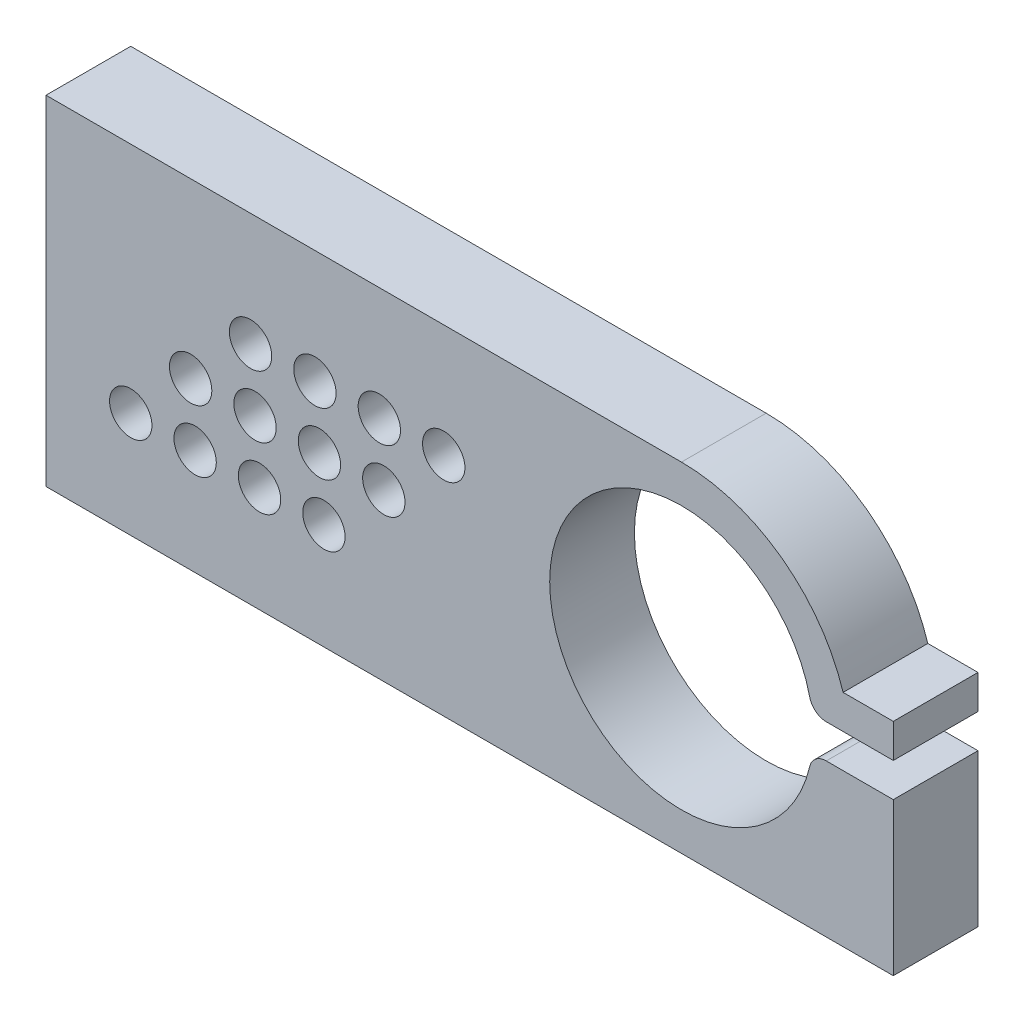
ISO-10303-21;
HEADER;
FILE_DESCRIPTION(('STEP AP214'),'2;1');
FILE_NAME('part.step','',(''),(''),'','','');
FILE_SCHEMA(('AUTOMOTIVE_DESIGN { 1 0 10303 214 1 1 1 1 }'));
ENDSEC;
DATA;
#1=APPLICATION_CONTEXT('core data for automotive mechanical design processes');
#2=APPLICATION_PROTOCOL_DEFINITION('international standard','automotive_design',2000,#1);
#3=PRODUCT_CONTEXT('',#1,'mechanical');
#4=PRODUCT('Part','Part','',(#3));
#5=PRODUCT_RELATED_PRODUCT_CATEGORY('part','',(#4));
#6=PRODUCT_DEFINITION_FORMATION('','',#4);
#7=PRODUCT_DEFINITION_CONTEXT('part definition',#1,'design');
#8=PRODUCT_DEFINITION('design','',#6,#7);
#9=PRODUCT_DEFINITION_SHAPE('','',#8);
#10=(LENGTH_UNIT() NAMED_UNIT(*) SI_UNIT(.MILLI.,.METRE.));
#11=(NAMED_UNIT(*) PLANE_ANGLE_UNIT() SI_UNIT($,.RADIAN.));
#12=(NAMED_UNIT(*) SI_UNIT($,.STERADIAN.) SOLID_ANGLE_UNIT());
#13=UNCERTAINTY_MEASURE_WITH_UNIT(LENGTH_MEASURE(1.E-05),#10,'distance_accuracy_value','');
#14=(GEOMETRIC_REPRESENTATION_CONTEXT(3) GLOBAL_UNCERTAINTY_ASSIGNED_CONTEXT((#13)) GLOBAL_UNIT_ASSIGNED_CONTEXT((#10,
#11,#12)) REPRESENTATION_CONTEXT('',''));
#15=CARTESIAN_POINT('',(0.,0.,0.));
#16=DIRECTION('',(0.,0.,1.));
#17=DIRECTION('',(1.,0.,0.));
#18=AXIS2_PLACEMENT_3D('',#15,#16,#17);
#19=CARTESIAN_POINT('',(63.5,0.,12.7));
#20=DIRECTION('',(-1.,0.,0.));
#21=DIRECTION('',(0.,0.,1.));
#22=AXIS2_PLACEMENT_3D('',#19,#20,#21);
#23=PLANE('',#22);
#24=DIRECTION('',(0.,1.,0.));
#25=VECTOR('',#24,1.);
#26=CARTESIAN_POINT('',(63.5,0.,0.));
#27=LINE('',#26,#25);
#28=CARTESIAN_POINT('',(63.5,-25.4,0.));
#29=VERTEX_POINT('',#28);
#30=CARTESIAN_POINT('',(63.5,-2.54,0.));
#31=VERTEX_POINT('',#30);
#32=EDGE_CURVE('E153',#29,#31,#27,.T.);
#33=ORIENTED_EDGE('',*,*,#32,.T.);
#34=DIRECTION('',(0.,0.,-1.));
#35=VECTOR('',#34,1.);
#36=CARTESIAN_POINT('',(63.5,-2.54,12.7));
#37=LINE('',#36,#35);
#38=CARTESIAN_POINT('',(63.5,-2.54,12.7));
#39=VERTEX_POINT('',#38);
#40=EDGE_CURVE('E134',#39,#31,#37,.T.);
#41=ORIENTED_EDGE('',*,*,#40,.F.);
#42=DIRECTION('',(0.,1.,0.));
#43=VECTOR('',#42,1.);
#44=CARTESIAN_POINT('',(63.5,0.,12.7));
#45=LINE('',#44,#43);
#46=CARTESIAN_POINT('',(63.5,-25.4,12.7));
#47=VERTEX_POINT('',#46);
#48=EDGE_CURVE('E139',#47,#39,#45,.T.);
#49=ORIENTED_EDGE('',*,*,#48,.F.);
#50=DIRECTION('',(0.,0.,-1.));
#51=VECTOR('',#50,1.);
#52=CARTESIAN_POINT('',(63.5,-25.4,12.7));
#53=LINE('',#52,#51);
#54=EDGE_CURVE('E230',#47,#29,#53,.T.);
#55=ORIENTED_EDGE('',*,*,#54,.T.);
#56=EDGE_LOOP('',(#33,#41,#49,#55));
#57=FACE_BOUND('',#56,.T.);
#58=ADVANCED_FACE('F40',(#57),#23,.F.);
#59=CARTESIAN_POINT('',(0.,-2.54,12.7));
#60=DIRECTION('',(0.,1.,0.));
#61=DIRECTION('',(0.,0.,1.));
#62=AXIS2_PLACEMENT_3D('',#59,#60,#61);
#63=PLANE('',#62);
#64=DIRECTION('',(1.,0.,0.));
#65=VECTOR('',#64,1.);
#66=CARTESIAN_POINT('',(0.,-2.54,0.));
#67=LINE('',#66,#65);
#68=CARTESIAN_POINT('',(53.4534029589832,-2.54,0.));
#69=VERTEX_POINT('',#68);
#70=EDGE_CURVE('E194',#69,#31,#67,.T.);
#71=ORIENTED_EDGE('',*,*,#70,.F.);
#72=DIRECTION('',(0.,0.,-1.));
#73=VECTOR('',#72,1.);
#74=CARTESIAN_POINT('',(53.4534029589832,-2.54,12.7));
#75=LINE('',#74,#73);
#76=CARTESIAN_POINT('',(53.4534029589832,-2.54,12.7));
#77=VERTEX_POINT('',#76);
#78=EDGE_CURVE('E64',#69,#77,#75,.F.);
#79=ORIENTED_EDGE('',*,*,#78,.T.);
#80=DIRECTION('',(1.,0.,0.));
#81=VECTOR('',#80,1.);
#82=CARTESIAN_POINT('',(0.,-2.54,12.7));
#83=LINE('',#82,#81);
#84=EDGE_CURVE('E130',#77,#39,#83,.T.);
#85=ORIENTED_EDGE('',*,*,#84,.T.);
#86=ORIENTED_EDGE('',*,*,#40,.T.);
#87=EDGE_LOOP('',(#71,#79,#85,#86));
#88=FACE_BOUND('',#87,.T.);
#89=ADVANCED_FACE('F132',(#88),#63,.T.);
#90=CARTESIAN_POINT('',(31.75,0.,12.7));
#91=DIRECTION('',(0.,0.,-1.));
#92=DIRECTION('',(-1.,0.,0.));
#93=AXIS2_PLACEMENT_3D('',#90,#91,#92);
#94=CYLINDRICAL_SURFACE('',#93,19.75);
#95=CARTESIAN_POINT('',(31.75,0.,12.7));
#96=DIRECTION('',(0.,0.,1.));
#97=DIRECTION('',(1.,0.,0.));
#98=AXIS2_PLACEMENT_3D('',#95,#96,#97);
#99=CIRCLE('',#98,19.75);
#100=CARTESIAN_POINT('',(50.9802471260618,4.50112157918349,12.7));
#101=VERTEX_POINT('',#100);
#102=CARTESIAN_POINT('',(50.9802471260618,-4.50112157918349,12.7));
#103=VERTEX_POINT('',#102);
#104=EDGE_CURVE('E138',#101,#103,#99,.T.);
#105=ORIENTED_EDGE('',*,*,#104,.T.);
#106=DIRECTION('',(0.,0.,-1.));
#107=VECTOR('',#106,1.);
#108=CARTESIAN_POINT('',(50.9802471260618,-4.50112157918349,12.7));
#109=LINE('',#108,#107);
#110=CARTESIAN_POINT('',(50.9802471260618,-4.50112157918349,0.));
#111=VERTEX_POINT('',#110);
#112=EDGE_CURVE('E160',#103,#111,#109,.T.);
#113=ORIENTED_EDGE('',*,*,#112,.T.);
#114=CARTESIAN_POINT('',(31.75,0.,0.));
#115=DIRECTION('',(0.,0.,1.));
#116=DIRECTION('',(1.,0.,0.));
#117=AXIS2_PLACEMENT_3D('',#114,#115,#116);
#118=CIRCLE('',#117,19.75);
#119=CARTESIAN_POINT('',(50.9802471260618,4.50112157918349,0.));
#120=VERTEX_POINT('',#119);
#121=EDGE_CURVE('E195',#120,#111,#118,.T.);
#122=ORIENTED_EDGE('',*,*,#121,.F.);
#123=DIRECTION('',(0.,0.,-1.));
#124=VECTOR('',#123,1.);
#125=CARTESIAN_POINT('',(50.9802471260618,4.50112157918349,12.7));
#126=LINE('',#125,#124);
#127=EDGE_CURVE('E155',#120,#101,#126,.F.);
#128=ORIENTED_EDGE('',*,*,#127,.T.);
#129=EDGE_LOOP('',(#105,#113,#122,#128));
#130=FACE_BOUND('',#129,.T.);
#131=ADVANCED_FACE('F184',(#130),#94,.F.);
#132=CARTESIAN_POINT('',(0.,2.54,12.7));
#133=DIRECTION('',(0.,1.,0.));
#134=DIRECTION('',(0.,0.,1.));
#135=AXIS2_PLACEMENT_3D('',#132,#133,#134);
#136=PLANE('',#135);
#137=DIRECTION('',(1.,0.,0.));
#138=VECTOR('',#137,1.);
#139=CARTESIAN_POINT('',(0.,2.54,12.7));
#140=LINE('',#139,#138);
#141=CARTESIAN_POINT('',(53.4534029589832,2.54,12.7));
#142=VERTEX_POINT('',#141);
#143=CARTESIAN_POINT('',(63.5,2.54,12.7));
#144=VERTEX_POINT('',#143);
#145=EDGE_CURVE('E189',#142,#144,#140,.T.);
#146=ORIENTED_EDGE('',*,*,#145,.F.);
#147=DIRECTION('',(0.,0.,1.));
#148=VECTOR('',#147,1.);
#149=CARTESIAN_POINT('',(53.4534029589832,2.54,0.));
#150=LINE('',#149,#148);
#151=CARTESIAN_POINT('',(53.4534029589832,2.54,0.));
#152=VERTEX_POINT('',#151);
#153=EDGE_CURVE('E11',#142,#152,#150,.F.);
#154=ORIENTED_EDGE('',*,*,#153,.T.);
#155=DIRECTION('',(1.,0.,0.));
#156=VECTOR('',#155,1.);
#157=CARTESIAN_POINT('',(0.,2.54,0.));
#158=LINE('',#157,#156);
#159=CARTESIAN_POINT('',(63.5,2.54,0.));
#160=VERTEX_POINT('',#159);
#161=EDGE_CURVE('E200',#152,#160,#158,.T.);
#162=ORIENTED_EDGE('',*,*,#161,.T.);
#163=DIRECTION('',(0.,0.,-1.));
#164=VECTOR('',#163,1.);
#165=CARTESIAN_POINT('',(63.5,2.54,12.7));
#166=LINE('',#165,#164);
#167=EDGE_CURVE('E156',#144,#160,#166,.T.);
#168=ORIENTED_EDGE('',*,*,#167,.F.);
#169=EDGE_LOOP('',(#146,#154,#162,#168));
#170=FACE_BOUND('',#169,.T.);
#171=ADVANCED_FACE('F469',(#170),#136,.F.);
#172=CARTESIAN_POINT('',(63.5,0.,12.7));
#173=DIRECTION('',(-1.,0.,0.));
#174=DIRECTION('',(0.,0.,1.));
#175=AXIS2_PLACEMENT_3D('',#172,#173,#174);
#176=PLANE('',#175);
#177=DIRECTION('',(0.,1.,0.));
#178=VECTOR('',#177,1.);
#179=CARTESIAN_POINT('',(63.5,0.,0.));
#180=LINE('',#179,#178);
#181=CARTESIAN_POINT('',(63.5,7.62,0.));
#182=VERTEX_POINT('',#181);
#183=EDGE_CURVE('E208',#160,#182,#180,.T.);
#184=ORIENTED_EDGE('',*,*,#183,.T.);
#185=DIRECTION('',(0.,0.,-1.));
#186=VECTOR('',#185,1.);
#187=CARTESIAN_POINT('',(63.5,7.62,12.7));
#188=LINE('',#187,#186);
#189=CARTESIAN_POINT('',(63.5,7.62,12.7));
#190=VERTEX_POINT('',#189);
#191=EDGE_CURVE('E163',#190,#182,#188,.T.);
#192=ORIENTED_EDGE('',*,*,#191,.F.);
#193=DIRECTION('',(0.,1.,0.));
#194=VECTOR('',#193,1.);
#195=CARTESIAN_POINT('',(63.5,0.,12.7));
#196=LINE('',#195,#194);
#197=EDGE_CURVE('E270',#144,#190,#196,.T.);
#198=ORIENTED_EDGE('',*,*,#197,.F.);
#199=ORIENTED_EDGE('',*,*,#167,.T.);
#200=EDGE_LOOP('',(#184,#192,#198,#199));
#201=FACE_BOUND('',#200,.T.);
#202=ADVANCED_FACE('F255',(#201),#176,.F.);
#203=CARTESIAN_POINT('',(0.,7.62,12.7));
#204=DIRECTION('',(0.,1.,0.));
#205=DIRECTION('',(0.,0.,1.));
#206=AXIS2_PLACEMENT_3D('',#203,#204,#205);
#207=PLANE('',#206);
#208=DIRECTION('',(1.,0.,0.));
#209=VECTOR('',#208,1.);
#210=CARTESIAN_POINT('',(0.,7.62,0.));
#211=LINE('',#210,#209);
#212=CARTESIAN_POINT('',(55.9800557159904,7.62,0.));
#213=VERTEX_POINT('',#212);
#214=EDGE_CURVE('E212',#213,#182,#211,.T.);
#215=ORIENTED_EDGE('',*,*,#214,.F.);
#216=DIRECTION('',(0.,0.,-1.));
#217=VECTOR('',#216,1.);
#218=CARTESIAN_POINT('',(55.9800557159904,7.62,12.7));
#219=LINE('',#218,#217);
#220=CARTESIAN_POINT('',(55.9800557159904,7.62,12.7));
#221=VERTEX_POINT('',#220);
#222=EDGE_CURVE('E242',#221,#213,#219,.T.);
#223=ORIENTED_EDGE('',*,*,#222,.F.);
#224=DIRECTION('',(1.,0.,0.));
#225=VECTOR('',#224,1.);
#226=CARTESIAN_POINT('',(0.,7.62,12.7));
#227=LINE('',#226,#225);
#228=EDGE_CURVE('E251',#221,#190,#227,.T.);
#229=ORIENTED_EDGE('',*,*,#228,.T.);
#230=ORIENTED_EDGE('',*,*,#191,.T.);
#231=EDGE_LOOP('',(#215,#223,#229,#230));
#232=FACE_BOUND('',#231,.T.);
#233=ADVANCED_FACE('F249',(#232),#207,.T.);
#234=CARTESIAN_POINT('',(31.75,0.,12.7));
#235=DIRECTION('',(0.,0.,-1.));
#236=DIRECTION('',(-1.,0.,0.));
#237=AXIS2_PLACEMENT_3D('',#234,#235,#236);
#238=CYLINDRICAL_SURFACE('',#237,25.4);
#239=CARTESIAN_POINT('',(31.75,0.,0.));
#240=DIRECTION('',(0.,0.,1.));
#241=DIRECTION('',(1.,0.,0.));
#242=AXIS2_PLACEMENT_3D('',#239,#240,#241);
#243=CIRCLE('',#242,25.4);
#244=CARTESIAN_POINT('',(31.75,25.4,0.));
#245=VERTEX_POINT('',#244);
#246=EDGE_CURVE('E216',#213,#245,#243,.T.);
#247=ORIENTED_EDGE('',*,*,#246,.T.);
#248=DIRECTION('',(0.,0.,-1.));
#249=VECTOR('',#248,1.);
#250=CARTESIAN_POINT('',(31.75,25.4,12.7));
#251=LINE('',#250,#249);
#252=CARTESIAN_POINT('',(31.75,25.4,12.7));
#253=VERTEX_POINT('',#252);
#254=EDGE_CURVE('E239',#253,#245,#251,.T.);
#255=ORIENTED_EDGE('',*,*,#254,.F.);
#256=CARTESIAN_POINT('',(31.75,0.,12.7));
#257=DIRECTION('',(0.,0.,1.));
#258=DIRECTION('',(1.,0.,0.));
#259=AXIS2_PLACEMENT_3D('',#256,#257,#258);
#260=CIRCLE('',#259,25.4);
#261=EDGE_CURVE('E265',#221,#253,#260,.T.);
#262=ORIENTED_EDGE('',*,*,#261,.F.);
#263=ORIENTED_EDGE('',*,*,#222,.T.);
#264=EDGE_LOOP('',(#247,#255,#262,#263));
#265=FACE_BOUND('',#264,.T.);
#266=ADVANCED_FACE('F262',(#265),#238,.T.);
#267=CARTESIAN_POINT('',(0.,25.4,12.7));
#268=DIRECTION('',(0.,1.,0.));
#269=DIRECTION('',(0.,0.,1.));
#270=AXIS2_PLACEMENT_3D('',#267,#268,#269);
#271=PLANE('',#270);
#272=DIRECTION('',(1.,0.,0.));
#273=VECTOR('',#272,1.);
#274=CARTESIAN_POINT('',(0.,25.4,0.));
#275=LINE('',#274,#273);
#276=CARTESIAN_POINT('',(-63.5,25.4,0.));
#277=VERTEX_POINT('',#276);
#278=EDGE_CURVE('E220',#277,#245,#275,.T.);
#279=ORIENTED_EDGE('',*,*,#278,.F.);
#280=DIRECTION('',(0.,0.,-1.));
#281=VECTOR('',#280,1.);
#282=CARTESIAN_POINT('',(-63.5,25.4,12.7));
#283=LINE('',#282,#281);
#284=CARTESIAN_POINT('',(-63.5,25.4,12.7));
#285=VERTEX_POINT('',#284);
#286=EDGE_CURVE('E236',#285,#277,#283,.T.);
#287=ORIENTED_EDGE('',*,*,#286,.F.);
#288=DIRECTION('',(1.,0.,0.));
#289=VECTOR('',#288,1.);
#290=CARTESIAN_POINT('',(0.,25.4,12.7));
#291=LINE('',#290,#289);
#292=EDGE_CURVE('E268',#285,#253,#291,.T.);
#293=ORIENTED_EDGE('',*,*,#292,.T.);
#294=ORIENTED_EDGE('',*,*,#254,.T.);
#295=EDGE_LOOP('',(#279,#287,#293,#294));
#296=FACE_BOUND('',#295,.T.);
#297=ADVANCED_FACE('F287',(#296),#271,.T.);
#298=CARTESIAN_POINT('',(-63.5,0.,12.7));
#299=DIRECTION('',(-1.,0.,0.));
#300=DIRECTION('',(0.,0.,1.));
#301=AXIS2_PLACEMENT_3D('',#298,#299,#300);
#302=PLANE('',#301);
#303=DIRECTION('',(0.,1.,0.));
#304=VECTOR('',#303,1.);
#305=CARTESIAN_POINT('',(-63.5,0.,0.));
#306=LINE('',#305,#304);
#307=CARTESIAN_POINT('',(-63.5,-25.4,0.));
#308=VERTEX_POINT('',#307);
#309=EDGE_CURVE('E224',#308,#277,#306,.T.);
#310=ORIENTED_EDGE('',*,*,#309,.F.);
#311=DIRECTION('',(0.,0.,-1.));
#312=VECTOR('',#311,1.);
#313=CARTESIAN_POINT('',(-63.5,-25.4,12.7));
#314=LINE('',#313,#312);
#315=CARTESIAN_POINT('',(-63.5,-25.4,12.7));
#316=VERTEX_POINT('',#315);
#317=EDGE_CURVE('E233',#316,#308,#314,.T.);
#318=ORIENTED_EDGE('',*,*,#317,.F.);
#319=DIRECTION('',(0.,1.,0.));
#320=VECTOR('',#319,1.);
#321=CARTESIAN_POINT('',(-63.5,0.,12.7));
#322=LINE('',#321,#320);
#323=EDGE_CURVE('E279',#316,#285,#322,.T.);
#324=ORIENTED_EDGE('',*,*,#323,.T.);
#325=ORIENTED_EDGE('',*,*,#286,.T.);
#326=EDGE_LOOP('',(#310,#318,#324,#325));
#327=FACE_BOUND('',#326,.T.);
#328=ADVANCED_FACE('F285',(#327),#302,.T.);
#329=CARTESIAN_POINT('',(0.,-25.4,12.7));
#330=DIRECTION('',(0.,1.,0.));
#331=DIRECTION('',(0.,0.,1.));
#332=AXIS2_PLACEMENT_3D('',#329,#330,#331);
#333=PLANE('',#332);
#334=DIRECTION('',(1.,0.,0.));
#335=VECTOR('',#334,1.);
#336=CARTESIAN_POINT('',(0.,-25.4,0.));
#337=LINE('',#336,#335);
#338=EDGE_CURVE('E150',#308,#29,#337,.T.);
#339=ORIENTED_EDGE('',*,*,#338,.T.);
#340=ORIENTED_EDGE('',*,*,#54,.F.);
#341=DIRECTION('',(1.,0.,0.));
#342=VECTOR('',#341,1.);
#343=CARTESIAN_POINT('',(0.,-25.4,12.7));
#344=LINE('',#343,#342);
#345=EDGE_CURVE('E145',#316,#47,#344,.T.);
#346=ORIENTED_EDGE('',*,*,#345,.F.);
#347=ORIENTED_EDGE('',*,*,#317,.T.);
#348=EDGE_LOOP('',(#339,#340,#346,#347));
#349=FACE_BOUND('',#348,.T.);
#350=ADVANCED_FACE('F290',(#349),#333,.F.);
#351=CARTESIAN_POINT('',(0.,0.,12.7));
#352=DIRECTION('',(0.,0.,1.));
#353=DIRECTION('',(1.,0.,0.));
#354=AXIS2_PLACEMENT_3D('',#351,#352,#353);
#355=PLANE('',#354);
#356=CARTESIAN_POINT('',(-50.8,-9.525,12.7));
#357=DIRECTION('',(0.,0.,1.));
#358=DIRECTION('',(1.,0.,0.));
#359=AXIS2_PLACEMENT_3D('',#356,#357,#358);
#360=CIRCLE('',#359,3.175);
#361=CARTESIAN_POINT('',(-47.625,-9.525,12.7));
#362=VERTEX_POINT('',#361);
#363=EDGE_CURVE('E373',#362,#362,#360,.T.);
#364=ORIENTED_EDGE('',*,*,#363,.F.);
#365=EDGE_LOOP('',(#364));
#366=FACE_BOUND('',#365,.T.);
#367=CARTESIAN_POINT('',(-3.88348775786174,8.43551224213834,12.7));
#368=DIRECTION('',(0.,0.,1.));
#369=DIRECTION('',(1.,0.,0.));
#370=AXIS2_PLACEMENT_3D('',#367,#368,#369);
#371=CIRCLE('',#370,3.17499999999999);
#372=CARTESIAN_POINT('',(-0.708487757861742,8.43551224213834,12.7));
#373=VERTEX_POINT('',#372);
#374=EDGE_CURVE('E405',#373,#373,#371,.T.);
#375=ORIENTED_EDGE('',*,*,#374,.F.);
#376=EDGE_LOOP('',(#375));
#377=FACE_BOUND('',#376,.T.);
#378=CARTESIAN_POINT('',(-12.8637438789309,-0.544743878930831,12.7));
#379=DIRECTION('',(0.,0.,1.));
#380=DIRECTION('',(1.,0.,0.));
#381=AXIS2_PLACEMENT_3D('',#378,#379,#380);
#382=CIRCLE('',#381,3.175);
#383=CARTESIAN_POINT('',(-9.68874387893088,-0.544743878930831,12.7));
#384=VERTEX_POINT('',#383);
#385=EDGE_CURVE('E397',#384,#384,#382,.T.);
#386=ORIENTED_EDGE('',*,*,#385,.F.);
#387=EDGE_LOOP('',(#386));
#388=FACE_BOUND('',#387,.T.);
#389=CARTESIAN_POINT('',(-21.844,-9.525,12.7));
#390=DIRECTION('',(0.,0.,1.));
#391=DIRECTION('',(1.,0.,0.));
#392=AXIS2_PLACEMENT_3D('',#389,#390,#391);
#393=CIRCLE('',#392,3.175);
#394=CARTESIAN_POINT('',(-18.669,-9.525,12.7));
#395=VERTEX_POINT('',#394);
#396=EDGE_CURVE('E389',#395,#395,#393,.T.);
#397=ORIENTED_EDGE('',*,*,#396,.F.);
#398=EDGE_LOOP('',(#397));
#399=FACE_BOUND('',#398,.T.);
#400=CARTESIAN_POINT('',(-32.1677438789309,-0.544743878930831,12.7));
#401=DIRECTION('',(0.,0.,1.));
#402=DIRECTION('',(1.,0.,0.));
#403=AXIS2_PLACEMENT_3D('',#400,#401,#402);
#404=CIRCLE('',#403,3.175);
#405=CARTESIAN_POINT('',(-28.9927438789309,-0.544743878930831,12.7));
#406=VERTEX_POINT('',#405);
#407=EDGE_CURVE('E429',#406,#406,#404,.T.);
#408=ORIENTED_EDGE('',*,*,#407,.F.);
#409=EDGE_LOOP('',(#408));
#410=FACE_BOUND('',#409,.T.);
#411=CARTESIAN_POINT('',(-41.148,-9.525,12.7));
#412=DIRECTION('',(0.,0.,1.));
#413=DIRECTION('',(1.,0.,0.));
#414=AXIS2_PLACEMENT_3D('',#411,#412,#413);
#415=CIRCLE('',#414,3.175);
#416=CARTESIAN_POINT('',(-37.973,-9.525,12.7));
#417=VERTEX_POINT('',#416);
#418=EDGE_CURVE('E446',#417,#417,#415,.T.);
#419=ORIENTED_EDGE('',*,*,#418,.F.);
#420=EDGE_LOOP('',(#419));
#421=FACE_BOUND('',#420,.T.);
#422=CARTESIAN_POINT('',(-32.8394877578617,8.43551224213834,12.7));
#423=DIRECTION('',(0.,0.,1.));
#424=DIRECTION('',(1.,0.,0.));
#425=AXIS2_PLACEMENT_3D('',#422,#423,#424);
#426=CIRCLE('',#425,3.17499999999999);
#427=CARTESIAN_POINT('',(-29.6644877578617,8.43551224213834,12.7));
#428=VERTEX_POINT('',#427);
#429=EDGE_CURVE('E445',#428,#428,#426,.T.);
#430=ORIENTED_EDGE('',*,*,#429,.F.);
#431=EDGE_LOOP('',(#430));
#432=FACE_BOUND('',#431,.T.);
#433=CARTESIAN_POINT('',(-41.8197438789309,-0.544743878930831,12.7));
#434=DIRECTION('',(0.,0.,1.));
#435=DIRECTION('',(1.,0.,0.));
#436=AXIS2_PLACEMENT_3D('',#433,#434,#435);
#437=CIRCLE('',#436,3.175);
#438=CARTESIAN_POINT('',(-38.6447438789309,-0.544743878930831,12.7));
#439=VERTEX_POINT('',#438);
#440=EDGE_CURVE('E381',#439,#439,#437,.T.);
#441=ORIENTED_EDGE('',*,*,#440,.F.);
#442=EDGE_LOOP('',(#441));
#443=FACE_BOUND('',#442,.T.);
#444=CARTESIAN_POINT('',(-13.5354877578617,8.43551224213834,12.7));
#445=DIRECTION('',(0.,0.,1.));
#446=DIRECTION('',(1.,0.,0.));
#447=AXIS2_PLACEMENT_3D('',#444,#445,#446);
#448=CIRCLE('',#447,3.17499999999999);
#449=CARTESIAN_POINT('',(-10.3604877578617,8.43551224213834,12.7));
#450=VERTEX_POINT('',#449);
#451=EDGE_CURVE('E388',#450,#450,#448,.T.);
#452=ORIENTED_EDGE('',*,*,#451,.F.);
#453=EDGE_LOOP('',(#452));
#454=FACE_BOUND('',#453,.T.);
#455=CARTESIAN_POINT('',(-22.5157438789309,-0.544743878930831,12.7));
#456=DIRECTION('',(0.,0.,1.));
#457=DIRECTION('',(1.,0.,0.));
#458=AXIS2_PLACEMENT_3D('',#455,#456,#457);
#459=CIRCLE('',#458,3.175);
#460=CARTESIAN_POINT('',(-19.3407438789309,-0.544743878930831,12.7));
#461=VERTEX_POINT('',#460);
#462=EDGE_CURVE('E414',#461,#461,#459,.T.);
#463=ORIENTED_EDGE('',*,*,#462,.F.);
#464=EDGE_LOOP('',(#463));
#465=FACE_BOUND('',#464,.T.);
#466=CARTESIAN_POINT('',(-31.496,-9.525,12.7));
#467=DIRECTION('',(0.,0.,1.));
#468=DIRECTION('',(1.,0.,0.));
#469=AXIS2_PLACEMENT_3D('',#466,#467,#468);
#470=CIRCLE('',#469,3.17499999999999);
#471=CARTESIAN_POINT('',(-28.321,-9.525,12.7));
#472=VERTEX_POINT('',#471);
#473=EDGE_CURVE('E413',#472,#472,#470,.T.);
#474=ORIENTED_EDGE('',*,*,#473,.F.);
#475=EDGE_LOOP('',(#474));
#476=FACE_BOUND('',#475,.T.);
#477=CARTESIAN_POINT('',(-23.1874877578617,8.43551224213834,12.7));
#478=DIRECTION('',(0.,0.,1.));
#479=DIRECTION('',(1.,0.,0.));
#480=AXIS2_PLACEMENT_3D('',#477,#478,#479);
#481=CIRCLE('',#480,3.17499999999999);
#482=CARTESIAN_POINT('',(-20.0124877578617,8.43551224213834,12.7));
#483=VERTEX_POINT('',#482);
#484=EDGE_CURVE('E430',#483,#483,#481,.T.);
#485=ORIENTED_EDGE('',*,*,#484,.F.);
#486=EDGE_LOOP('',(#485));
#487=FACE_BOUND('',#486,.T.);
#488=ORIENTED_EDGE('',*,*,#84,.F.);
#489=CARTESIAN_POINT('',(53.4534029589832,-5.08,12.7));
#490=DIRECTION('',(0.,0.,1.));
#491=DIRECTION('',(1.,0.,0.));
#492=AXIS2_PLACEMENT_3D('',#489,#490,#491);
#493=CIRCLE('',#492,2.54);
#494=EDGE_CURVE('E49',#77,#103,#493,.T.);
#495=ORIENTED_EDGE('',*,*,#494,.T.);
#496=ORIENTED_EDGE('',*,*,#104,.F.);
#497=CARTESIAN_POINT('',(53.4534029589832,5.08,12.7));
#498=DIRECTION('',(0.,0.,1.));
#499=DIRECTION('',(1.,0.,0.));
#500=AXIS2_PLACEMENT_3D('',#497,#498,#499);
#501=CIRCLE('',#500,2.54);
#502=EDGE_CURVE('E56',#101,#142,#501,.T.);
#503=ORIENTED_EDGE('',*,*,#502,.T.);
#504=ORIENTED_EDGE('',*,*,#145,.T.);
#505=ORIENTED_EDGE('',*,*,#197,.T.);
#506=ORIENTED_EDGE('',*,*,#228,.F.);
#507=ORIENTED_EDGE('',*,*,#261,.T.);
#508=ORIENTED_EDGE('',*,*,#292,.F.);
#509=ORIENTED_EDGE('',*,*,#323,.F.);
#510=ORIENTED_EDGE('',*,*,#345,.T.);
#511=ORIENTED_EDGE('',*,*,#48,.T.);
#512=EDGE_LOOP('',(#488,#495,#496,#503,#504,#505,#506,#507,#508,#509,#510,#511));
#513=FACE_BOUND('',#512,.T.);
#514=ADVANCED_FACE('F142',(#366,#377,#388,#399,#410,#421,#432,#443,#454,#465,#476,#487,#513),
#355,.T.);
#515=CARTESIAN_POINT('',(0.,0.,0.));
#516=DIRECTION('',(0.,0.,1.));
#517=DIRECTION('',(1.,0.,0.));
#518=AXIS2_PLACEMENT_3D('',#515,#516,#517);
#519=PLANE('',#518);
#520=CARTESIAN_POINT('',(-50.8,-9.525,0.));
#521=DIRECTION('',(0.,0.,1.));
#522=DIRECTION('',(1.,0.,0.));
#523=AXIS2_PLACEMENT_3D('',#520,#521,#522);
#524=CIRCLE('',#523,3.175);
#525=CARTESIAN_POINT('',(-47.625,-9.525,0.));
#526=VERTEX_POINT('',#525);
#527=EDGE_CURVE('E202',#526,#526,#524,.T.);
#528=ORIENTED_EDGE('',*,*,#527,.T.);
#529=EDGE_LOOP('',(#528));
#530=FACE_BOUND('',#529,.T.);
#531=CARTESIAN_POINT('',(-3.88348775786174,8.43551224213834,0.));
#532=DIRECTION('',(0.,0.,1.));
#533=DIRECTION('',(1.,0.,0.));
#534=AXIS2_PLACEMENT_3D('',#531,#532,#533);
#535=CIRCLE('',#534,3.17499999999999);
#536=CARTESIAN_POINT('',(-0.708487757861742,8.43551224213834,0.));
#537=VERTEX_POINT('',#536);
#538=EDGE_CURVE('E401',#537,#537,#535,.T.);
#539=ORIENTED_EDGE('',*,*,#538,.T.);
#540=EDGE_LOOP('',(#539));
#541=FACE_BOUND('',#540,.T.);
#542=CARTESIAN_POINT('',(-12.8637438789309,-0.544743878930831,0.));
#543=DIRECTION('',(0.,0.,1.));
#544=DIRECTION('',(1.,0.,0.));
#545=AXIS2_PLACEMENT_3D('',#542,#543,#544);
#546=CIRCLE('',#545,3.175);
#547=CARTESIAN_POINT('',(-9.68874387893088,-0.544743878930831,0.));
#548=VERTEX_POINT('',#547);
#549=EDGE_CURVE('E393',#548,#548,#546,.T.);
#550=ORIENTED_EDGE('',*,*,#549,.T.);
#551=EDGE_LOOP('',(#550));
#552=FACE_BOUND('',#551,.T.);
#553=CARTESIAN_POINT('',(-21.844,-9.525,0.));
#554=DIRECTION('',(0.,0.,1.));
#555=DIRECTION('',(1.,0.,0.));
#556=AXIS2_PLACEMENT_3D('',#553,#554,#555);
#557=CIRCLE('',#556,3.175);
#558=CARTESIAN_POINT('',(-18.669,-9.525,0.));
#559=VERTEX_POINT('',#558);
#560=EDGE_CURVE('E384',#559,#559,#557,.T.);
#561=ORIENTED_EDGE('',*,*,#560,.T.);
#562=EDGE_LOOP('',(#561));
#563=FACE_BOUND('',#562,.T.);
#564=CARTESIAN_POINT('',(-32.1677438789309,-0.544743878930831,0.));
#565=DIRECTION('',(0.,0.,1.));
#566=DIRECTION('',(1.,0.,0.));
#567=AXIS2_PLACEMENT_3D('',#564,#565,#566);
#568=CIRCLE('',#567,3.175);
#569=CARTESIAN_POINT('',(-28.9927438789309,-0.544743878930831,0.));
#570=VERTEX_POINT('',#569);
#571=EDGE_CURVE('E450',#570,#570,#568,.T.);
#572=ORIENTED_EDGE('',*,*,#571,.T.);
#573=EDGE_LOOP('',(#572));
#574=FACE_BOUND('',#573,.T.);
#575=CARTESIAN_POINT('',(-41.148,-9.525,0.));
#576=DIRECTION('',(0.,0.,1.));
#577=DIRECTION('',(1.,0.,0.));
#578=AXIS2_PLACEMENT_3D('',#575,#576,#577);
#579=CIRCLE('',#578,3.175);
#580=CARTESIAN_POINT('',(-37.973,-9.525,0.));
#581=VERTEX_POINT('',#580);
#582=EDGE_CURVE('E441',#581,#581,#579,.T.);
#583=ORIENTED_EDGE('',*,*,#582,.T.);
#584=EDGE_LOOP('',(#583));
#585=FACE_BOUND('',#584,.T.);
#586=CARTESIAN_POINT('',(-32.8394877578617,8.43551224213834,0.));
#587=DIRECTION('',(0.,0.,1.));
#588=DIRECTION('',(1.,0.,0.));
#589=AXIS2_PLACEMENT_3D('',#586,#587,#588);
#590=CIRCLE('',#589,3.17499999999999);
#591=CARTESIAN_POINT('',(-29.6644877578617,8.43551224213834,0.));
#592=VERTEX_POINT('',#591);
#593=EDGE_CURVE('E460',#592,#592,#590,.T.);
#594=ORIENTED_EDGE('',*,*,#593,.T.);
#595=EDGE_LOOP('',(#594));
#596=FACE_BOUND('',#595,.T.);
#597=CARTESIAN_POINT('',(-41.8197438789309,-0.544743878930831,0.));
#598=DIRECTION('',(0.,0.,1.));
#599=DIRECTION('',(1.,0.,0.));
#600=AXIS2_PLACEMENT_3D('',#597,#598,#599);
#601=CIRCLE('',#600,3.175);
#602=CARTESIAN_POINT('',(-38.6447438789309,-0.544743878930831,0.));
#603=VERTEX_POINT('',#602);
#604=EDGE_CURVE('E375',#603,#603,#601,.T.);
#605=ORIENTED_EDGE('',*,*,#604,.T.);
#606=EDGE_LOOP('',(#605));
#607=FACE_BOUND('',#606,.T.);
#608=CARTESIAN_POINT('',(-13.5354877578617,8.43551224213834,0.));
#609=DIRECTION('',(0.,0.,1.));
#610=DIRECTION('',(1.,0.,0.));
#611=AXIS2_PLACEMENT_3D('',#608,#609,#610);
#612=CIRCLE('',#611,3.17499999999999);
#613=CARTESIAN_POINT('',(-10.3604877578617,8.43551224213834,0.));
#614=VERTEX_POINT('',#613);
#615=EDGE_CURVE('E418',#614,#614,#612,.T.);
#616=ORIENTED_EDGE('',*,*,#615,.T.);
#617=EDGE_LOOP('',(#616));
#618=FACE_BOUND('',#617,.T.);
#619=CARTESIAN_POINT('',(-22.5157438789309,-0.544743878930831,0.));
#620=DIRECTION('',(0.,0.,1.));
#621=DIRECTION('',(1.,0.,0.));
#622=AXIS2_PLACEMENT_3D('',#619,#620,#621);
#623=CIRCLE('',#622,3.175);
#624=CARTESIAN_POINT('',(-19.3407438789309,-0.544743878930831,0.));
#625=VERTEX_POINT('',#624);
#626=EDGE_CURVE('E409',#625,#625,#623,.T.);
#627=ORIENTED_EDGE('',*,*,#626,.T.);
#628=EDGE_LOOP('',(#627));
#629=FACE_BOUND('',#628,.T.);
#630=CARTESIAN_POINT('',(-31.496,-9.525,0.));
#631=DIRECTION('',(0.,0.,1.));
#632=DIRECTION('',(1.,0.,0.));
#633=AXIS2_PLACEMENT_3D('',#630,#631,#632);
#634=CIRCLE('',#633,3.17499999999999);
#635=CARTESIAN_POINT('',(-28.321,-9.525,0.));
#636=VERTEX_POINT('',#635);
#637=EDGE_CURVE('E434',#636,#636,#634,.T.);
#638=ORIENTED_EDGE('',*,*,#637,.T.);
#639=EDGE_LOOP('',(#638));
#640=FACE_BOUND('',#639,.T.);
#641=CARTESIAN_POINT('',(-23.1874877578617,8.43551224213834,0.));
#642=DIRECTION('',(0.,0.,1.));
#643=DIRECTION('',(1.,0.,0.));
#644=AXIS2_PLACEMENT_3D('',#641,#642,#643);
#645=CIRCLE('',#644,3.17499999999999);
#646=CARTESIAN_POINT('',(-20.0124877578617,8.43551224213834,0.));
#647=VERTEX_POINT('',#646);
#648=EDGE_CURVE('E425',#647,#647,#645,.T.);
#649=ORIENTED_EDGE('',*,*,#648,.T.);
#650=EDGE_LOOP('',(#649));
#651=FACE_BOUND('',#650,.T.);
#652=ORIENTED_EDGE('',*,*,#121,.T.);
#653=CARTESIAN_POINT('',(53.4534029589832,-5.08,0.));
#654=DIRECTION('',(0.,0.,1.));
#655=DIRECTION('',(1.,0.,0.));
#656=AXIS2_PLACEMENT_3D('',#653,#654,#655);
#657=CIRCLE('',#656,2.54);
#658=EDGE_CURVE('E173',#111,#69,#657,.F.);
#659=ORIENTED_EDGE('',*,*,#658,.T.);
#660=ORIENTED_EDGE('',*,*,#70,.T.);
#661=ORIENTED_EDGE('',*,*,#32,.F.);
#662=ORIENTED_EDGE('',*,*,#338,.F.);
#663=ORIENTED_EDGE('',*,*,#309,.T.);
#664=ORIENTED_EDGE('',*,*,#278,.T.);
#665=ORIENTED_EDGE('',*,*,#246,.F.);
#666=ORIENTED_EDGE('',*,*,#214,.T.);
#667=ORIENTED_EDGE('',*,*,#183,.F.);
#668=ORIENTED_EDGE('',*,*,#161,.F.);
#669=CARTESIAN_POINT('',(53.4534029589832,5.08,0.));
#670=DIRECTION('',(0.,0.,1.));
#671=DIRECTION('',(1.,0.,0.));
#672=AXIS2_PLACEMENT_3D('',#669,#670,#671);
#673=CIRCLE('',#672,2.54);
#674=EDGE_CURVE('E170',#152,#120,#673,.F.);
#675=ORIENTED_EDGE('',*,*,#674,.T.);
#676=EDGE_LOOP('',(#652,#659,#660,#661,#662,#663,#664,#665,#666,#667,#668,#675));
#677=FACE_BOUND('',#676,.T.);
#678=ADVANCED_FACE('F193',(#530,#541,#552,#563,#574,#585,#596,#607,#618,#629,#640,#651,#677),
#519,.F.);
#679=CARTESIAN_POINT('',(53.4534029589832,-5.08,12.7));
#680=DIRECTION('',(0.,0.,-1.));
#681=DIRECTION('',(-1.,0.,0.));
#682=AXIS2_PLACEMENT_3D('',#679,#680,#681);
#683=CYLINDRICAL_SURFACE('',#682,2.54);
#684=ORIENTED_EDGE('',*,*,#494,.F.);
#685=ORIENTED_EDGE('',*,*,#78,.F.);
#686=ORIENTED_EDGE('',*,*,#658,.F.);
#687=ORIENTED_EDGE('',*,*,#112,.F.);
#688=EDGE_LOOP('',(#684,#685,#686,#687));
#689=FACE_BOUND('',#688,.T.);
#690=ADVANCED_FACE('F191',(#689),#683,.T.);
#691=CARTESIAN_POINT('',(53.4534029589832,5.08,12.7));
#692=DIRECTION('',(0.,0.,-1.));
#693=DIRECTION('',(-1.,0.,0.));
#694=AXIS2_PLACEMENT_3D('',#691,#692,#693);
#695=CYLINDRICAL_SURFACE('',#694,2.54);
#696=ORIENTED_EDGE('',*,*,#502,.F.);
#697=ORIENTED_EDGE('',*,*,#127,.F.);
#698=ORIENTED_EDGE('',*,*,#674,.F.);
#699=ORIENTED_EDGE('',*,*,#153,.F.);
#700=EDGE_LOOP('',(#696,#697,#698,#699));
#701=FACE_BOUND('',#700,.T.);
#702=ADVANCED_FACE('F42',(#701),#695,.T.);
#703=CARTESIAN_POINT('',(-23.1874877578617,8.43551224213834,0.));
#704=DIRECTION('',(0.,0.,1.));
#705=DIRECTION('',(1.,0.,0.));
#706=AXIS2_PLACEMENT_3D('',#703,#704,#705);
#707=CYLINDRICAL_SURFACE('',#706,3.17499999999999);
#708=ORIENTED_EDGE('',*,*,#648,.F.);
#709=EDGE_LOOP('',(#708));
#710=FACE_BOUND('',#709,.T.);
#711=ORIENTED_EDGE('',*,*,#484,.T.);
#712=EDGE_LOOP('',(#711));
#713=FACE_BOUND('',#712,.T.);
#714=ADVANCED_FACE('F313',(#710,#713),#707,.F.);
#715=CARTESIAN_POINT('',(-31.496,-9.525,0.));
#716=DIRECTION('',(0.,0.,1.));
#717=DIRECTION('',(1.,0.,0.));
#718=AXIS2_PLACEMENT_3D('',#715,#716,#717);
#719=CYLINDRICAL_SURFACE('',#718,3.17499999999999);
#720=ORIENTED_EDGE('',*,*,#637,.F.);
#721=EDGE_LOOP('',(#720));
#722=FACE_BOUND('',#721,.T.);
#723=ORIENTED_EDGE('',*,*,#473,.T.);
#724=EDGE_LOOP('',(#723));
#725=FACE_BOUND('',#724,.T.);
#726=ADVANCED_FACE('F339',(#722,#725),#719,.F.);
#727=CARTESIAN_POINT('',(-22.5157438789309,-0.544743878930831,0.));
#728=DIRECTION('',(0.,0.,1.));
#729=DIRECTION('',(1.,0.,0.));
#730=AXIS2_PLACEMENT_3D('',#727,#728,#729);
#731=CYLINDRICAL_SURFACE('',#730,3.175);
#732=ORIENTED_EDGE('',*,*,#626,.F.);
#733=EDGE_LOOP('',(#732));
#734=FACE_BOUND('',#733,.T.);
#735=ORIENTED_EDGE('',*,*,#462,.T.);
#736=EDGE_LOOP('',(#735));
#737=FACE_BOUND('',#736,.T.);
#738=ADVANCED_FACE('F342',(#734,#737),#731,.F.);
#739=CARTESIAN_POINT('',(-13.5354877578617,8.43551224213834,0.));
#740=DIRECTION('',(0.,0.,1.));
#741=DIRECTION('',(1.,0.,0.));
#742=AXIS2_PLACEMENT_3D('',#739,#740,#741);
#743=CYLINDRICAL_SURFACE('',#742,3.17499999999999);
#744=ORIENTED_EDGE('',*,*,#615,.F.);
#745=EDGE_LOOP('',(#744));
#746=FACE_BOUND('',#745,.T.);
#747=ORIENTED_EDGE('',*,*,#451,.T.);
#748=EDGE_LOOP('',(#747));
#749=FACE_BOUND('',#748,.T.);
#750=ADVANCED_FACE('F329',(#746,#749),#743,.F.);
#751=CARTESIAN_POINT('',(-41.8197438789309,-0.544743878930831,0.));
#752=DIRECTION('',(0.,0.,1.));
#753=DIRECTION('',(1.,0.,0.));
#754=AXIS2_PLACEMENT_3D('',#751,#752,#753);
#755=CYLINDRICAL_SURFACE('',#754,3.175);
#756=ORIENTED_EDGE('',*,*,#604,.F.);
#757=EDGE_LOOP('',(#756));
#758=FACE_BOUND('',#757,.T.);
#759=ORIENTED_EDGE('',*,*,#440,.T.);
#760=EDGE_LOOP('',(#759));
#761=FACE_BOUND('',#760,.T.);
#762=ADVANCED_FACE('F325',(#758,#761),#755,.F.);
#763=CARTESIAN_POINT('',(-32.8394877578617,8.43551224213834,0.));
#764=DIRECTION('',(0.,0.,1.));
#765=DIRECTION('',(1.,0.,0.));
#766=AXIS2_PLACEMENT_3D('',#763,#764,#765);
#767=CYLINDRICAL_SURFACE('',#766,3.17499999999999);
#768=ORIENTED_EDGE('',*,*,#593,.F.);
#769=EDGE_LOOP('',(#768));
#770=FACE_BOUND('',#769,.T.);
#771=ORIENTED_EDGE('',*,*,#429,.T.);
#772=EDGE_LOOP('',(#771));
#773=FACE_BOUND('',#772,.T.);
#774=ADVANCED_FACE('F321',(#770,#773),#767,.F.);
#775=CARTESIAN_POINT('',(-41.148,-9.525,0.));
#776=DIRECTION('',(0.,0.,1.));
#777=DIRECTION('',(1.,0.,0.));
#778=AXIS2_PLACEMENT_3D('',#775,#776,#777);
#779=CYLINDRICAL_SURFACE('',#778,3.175);
#780=ORIENTED_EDGE('',*,*,#582,.F.);
#781=EDGE_LOOP('',(#780));
#782=FACE_BOUND('',#781,.T.);
#783=ORIENTED_EDGE('',*,*,#418,.T.);
#784=EDGE_LOOP('',(#783));
#785=FACE_BOUND('',#784,.T.);
#786=ADVANCED_FACE('F324',(#782,#785),#779,.F.);
#787=CARTESIAN_POINT('',(-32.1677438789309,-0.544743878930831,0.));
#788=DIRECTION('',(0.,0.,1.));
#789=DIRECTION('',(1.,0.,0.));
#790=AXIS2_PLACEMENT_3D('',#787,#788,#789);
#791=CYLINDRICAL_SURFACE('',#790,3.175);
#792=ORIENTED_EDGE('',*,*,#571,.F.);
#793=EDGE_LOOP('',(#792));
#794=FACE_BOUND('',#793,.T.);
#795=ORIENTED_EDGE('',*,*,#407,.T.);
#796=EDGE_LOOP('',(#795));
#797=FACE_BOUND('',#796,.T.);
#798=ADVANCED_FACE('F331',(#794,#797),#791,.F.);
#799=CARTESIAN_POINT('',(-21.844,-9.525,0.));
#800=DIRECTION('',(0.,0.,1.));
#801=DIRECTION('',(1.,0.,0.));
#802=AXIS2_PLACEMENT_3D('',#799,#800,#801);
#803=CYLINDRICAL_SURFACE('',#802,3.175);
#804=ORIENTED_EDGE('',*,*,#560,.F.);
#805=EDGE_LOOP('',(#804));
#806=FACE_BOUND('',#805,.T.);
#807=ORIENTED_EDGE('',*,*,#396,.T.);
#808=EDGE_LOOP('',(#807));
#809=FACE_BOUND('',#808,.T.);
#810=ADVANCED_FACE('F334',(#806,#809),#803,.F.);
#811=CARTESIAN_POINT('',(-12.8637438789309,-0.544743878930831,0.));
#812=DIRECTION('',(0.,0.,1.));
#813=DIRECTION('',(1.,0.,0.));
#814=AXIS2_PLACEMENT_3D('',#811,#812,#813);
#815=CYLINDRICAL_SURFACE('',#814,3.175);
#816=ORIENTED_EDGE('',*,*,#549,.F.);
#817=EDGE_LOOP('',(#816));
#818=FACE_BOUND('',#817,.T.);
#819=ORIENTED_EDGE('',*,*,#385,.T.);
#820=EDGE_LOOP('',(#819));
#821=FACE_BOUND('',#820,.T.);
#822=ADVANCED_FACE('F357',(#818,#821),#815,.F.);
#823=CARTESIAN_POINT('',(-3.88348775786174,8.43551224213834,0.));
#824=DIRECTION('',(0.,0.,1.));
#825=DIRECTION('',(1.,0.,0.));
#826=AXIS2_PLACEMENT_3D('',#823,#824,#825);
#827=CYLINDRICAL_SURFACE('',#826,3.17499999999999);
#828=ORIENTED_EDGE('',*,*,#538,.F.);
#829=EDGE_LOOP('',(#828));
#830=FACE_BOUND('',#829,.T.);
#831=ORIENTED_EDGE('',*,*,#374,.T.);
#832=EDGE_LOOP('',(#831));
#833=FACE_BOUND('',#832,.T.);
#834=ADVANCED_FACE('F353',(#830,#833),#827,.F.);
#835=CARTESIAN_POINT('',(-50.8,-9.525,0.));
#836=DIRECTION('',(0.,0.,1.));
#837=DIRECTION('',(1.,0.,0.));
#838=AXIS2_PLACEMENT_3D('',#835,#836,#837);
#839=CYLINDRICAL_SURFACE('',#838,3.175);
#840=ORIENTED_EDGE('',*,*,#527,.F.);
#841=EDGE_LOOP('',(#840));
#842=FACE_BOUND('',#841,.T.);
#843=ORIENTED_EDGE('',*,*,#363,.T.);
#844=EDGE_LOOP('',(#843));
#845=FACE_BOUND('',#844,.T.);
#846=ADVANCED_FACE('F356',(#842,#845),#839,.F.);
#847=CLOSED_SHELL('',(#58,#89,#131,#171,#202,#233,#266,#297,#328,#350,#514,#678,#690,#702,#714,
#726,#738,#750,#762,#774,#786,#798,#810,#822,#834,#846));
#848=MANIFOLD_SOLID_BREP('B2',#847);
#849=ADVANCED_BREP_SHAPE_REPRESENTATION('',(#18,#848),#14);
#850=SHAPE_DEFINITION_REPRESENTATION(#9,#849);
ENDSEC;
END-ISO-10303-21;
